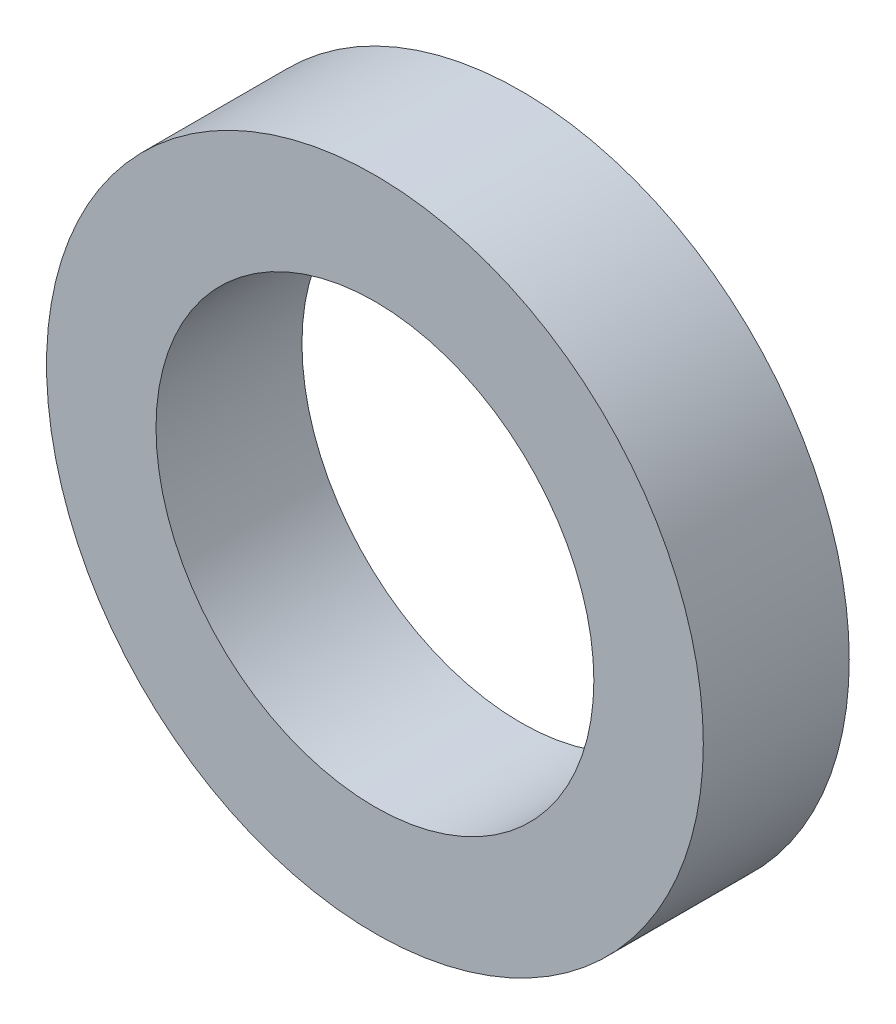
ISO-10303-21;
HEADER;
FILE_DESCRIPTION(('STEP AP214'),'2;1');
FILE_NAME('part.step','',(''),(''),'','','');
FILE_SCHEMA(('AUTOMOTIVE_DESIGN { 1 0 10303 214 1 1 1 1 }'));
ENDSEC;
DATA;
#1=APPLICATION_CONTEXT('core data for automotive mechanical design processes');
#2=APPLICATION_PROTOCOL_DEFINITION('international standard','automotive_design',2000,#1);
#3=PRODUCT_CONTEXT('',#1,'mechanical');
#4=PRODUCT('Part','Part','',(#3));
#5=PRODUCT_RELATED_PRODUCT_CATEGORY('part','',(#4));
#6=PRODUCT_DEFINITION_FORMATION('','',#4);
#7=PRODUCT_DEFINITION_CONTEXT('part definition',#1,'design');
#8=PRODUCT_DEFINITION('design','',#6,#7);
#9=PRODUCT_DEFINITION_SHAPE('','',#8);
#10=(LENGTH_UNIT() NAMED_UNIT(*) SI_UNIT(.MILLI.,.METRE.));
#11=(NAMED_UNIT(*) PLANE_ANGLE_UNIT() SI_UNIT($,.RADIAN.));
#12=(NAMED_UNIT(*) SI_UNIT($,.STERADIAN.) SOLID_ANGLE_UNIT());
#13=UNCERTAINTY_MEASURE_WITH_UNIT(LENGTH_MEASURE(1.E-05),#10,'distance_accuracy_value','');
#14=(GEOMETRIC_REPRESENTATION_CONTEXT(3) GLOBAL_UNCERTAINTY_ASSIGNED_CONTEXT((#13)) GLOBAL_UNIT_ASSIGNED_CONTEXT((#10,
#11,#12)) REPRESENTATION_CONTEXT('',''));
#15=CARTESIAN_POINT('',(0.,0.,0.));
#16=DIRECTION('',(0.,0.,1.));
#17=DIRECTION('',(1.,0.,0.));
#18=AXIS2_PLACEMENT_3D('',#15,#16,#17);
#19=CARTESIAN_POINT('',(0.,0.,2.));
#20=DIRECTION('',(0.,0.,1.));
#21=DIRECTION('',(1.,0.,0.));
#22=AXIS2_PLACEMENT_3D('',#19,#20,#21);
#23=PLANE('',#22);
#24=CARTESIAN_POINT('',(0.,0.,2.));
#25=DIRECTION('',(0.,0.,1.));
#26=DIRECTION('',(1.,0.,0.));
#27=AXIS2_PLACEMENT_3D('',#24,#25,#26);
#28=CIRCLE('',#27,9.);
#29=CARTESIAN_POINT('',(9.,0.,2.));
#30=VERTEX_POINT('',#29);
#31=EDGE_CURVE('E10',#30,#30,#28,.T.);
#32=ORIENTED_EDGE('',*,*,#31,.T.);
#33=EDGE_LOOP('',(#32));
#34=FACE_BOUND('',#33,.T.);
#35=CARTESIAN_POINT('',(0.,0.,2.));
#36=DIRECTION('',(0.,0.,1.));
#37=DIRECTION('',(1.,0.,0.));
#38=AXIS2_PLACEMENT_3D('',#35,#36,#37);
#39=CIRCLE('',#38,6.);
#40=CARTESIAN_POINT('',(6.,0.,2.));
#41=VERTEX_POINT('',#40);
#42=EDGE_CURVE('E44',#41,#41,#39,.T.);
#43=ORIENTED_EDGE('',*,*,#42,.F.);
#44=EDGE_LOOP('',(#43));
#45=FACE_BOUND('',#44,.T.);
#46=ADVANCED_FACE('F33',(#34,#45),#23,.T.);
#47=CARTESIAN_POINT('',(0.,0.,-2.));
#48=DIRECTION('',(0.,0.,1.));
#49=DIRECTION('',(1.,0.,0.));
#50=AXIS2_PLACEMENT_3D('',#47,#48,#49);
#51=PLANE('',#50);
#52=CARTESIAN_POINT('',(0.,0.,-2.));
#53=DIRECTION('',(0.,0.,1.));
#54=DIRECTION('',(1.,0.,0.));
#55=AXIS2_PLACEMENT_3D('',#52,#53,#54);
#56=CIRCLE('',#55,9.);
#57=CARTESIAN_POINT('',(9.,0.,-2.));
#58=VERTEX_POINT('',#57);
#59=EDGE_CURVE('E37',#58,#58,#56,.T.);
#60=ORIENTED_EDGE('',*,*,#59,.F.);
#61=EDGE_LOOP('',(#60));
#62=FACE_BOUND('',#61,.T.);
#63=CARTESIAN_POINT('',(0.,0.,-2.));
#64=DIRECTION('',(0.,0.,1.));
#65=DIRECTION('',(1.,0.,0.));
#66=AXIS2_PLACEMENT_3D('',#63,#64,#65);
#67=CIRCLE('',#66,6.);
#68=CARTESIAN_POINT('',(6.,0.,-2.));
#69=VERTEX_POINT('',#68);
#70=EDGE_CURVE('E46',#69,#69,#67,.T.);
#71=ORIENTED_EDGE('',*,*,#70,.T.);
#72=EDGE_LOOP('',(#71));
#73=FACE_BOUND('',#72,.T.);
#74=ADVANCED_FACE('F56',(#62,#73),#51,.F.);
#75=CARTESIAN_POINT('',(0.,0.,2.));
#76=DIRECTION('',(0.,0.,-1.));
#77=DIRECTION('',(-1.,0.,0.));
#78=AXIS2_PLACEMENT_3D('',#75,#76,#77);
#79=CYLINDRICAL_SURFACE('',#78,9.);
#80=ORIENTED_EDGE('',*,*,#31,.F.);
#81=EDGE_LOOP('',(#80));
#82=FACE_BOUND('',#81,.T.);
#83=ORIENTED_EDGE('',*,*,#59,.T.);
#84=EDGE_LOOP('',(#83));
#85=FACE_BOUND('',#84,.T.);
#86=ADVANCED_FACE('F35',(#82,#85),#79,.T.);
#87=CARTESIAN_POINT('',(0.,0.,2.));
#88=DIRECTION('',(0.,0.,-1.));
#89=DIRECTION('',(-1.,0.,0.));
#90=AXIS2_PLACEMENT_3D('',#87,#88,#89);
#91=CYLINDRICAL_SURFACE('',#90,6.);
#92=ORIENTED_EDGE('',*,*,#42,.T.);
#93=EDGE_LOOP('',(#92));
#94=FACE_BOUND('',#93,.T.);
#95=ORIENTED_EDGE('',*,*,#70,.F.);
#96=EDGE_LOOP('',(#95));
#97=FACE_BOUND('',#96,.T.);
#98=ADVANCED_FACE('F52',(#94,#97),#91,.F.);
#99=CLOSED_SHELL('',(#46,#74,#86,#98));
#100=MANIFOLD_SOLID_BREP('B2',#99);
#101=ADVANCED_BREP_SHAPE_REPRESENTATION('',(#18,#100),#14);
#102=SHAPE_DEFINITION_REPRESENTATION(#9,#101);
ENDSEC;
END-ISO-10303-21;
